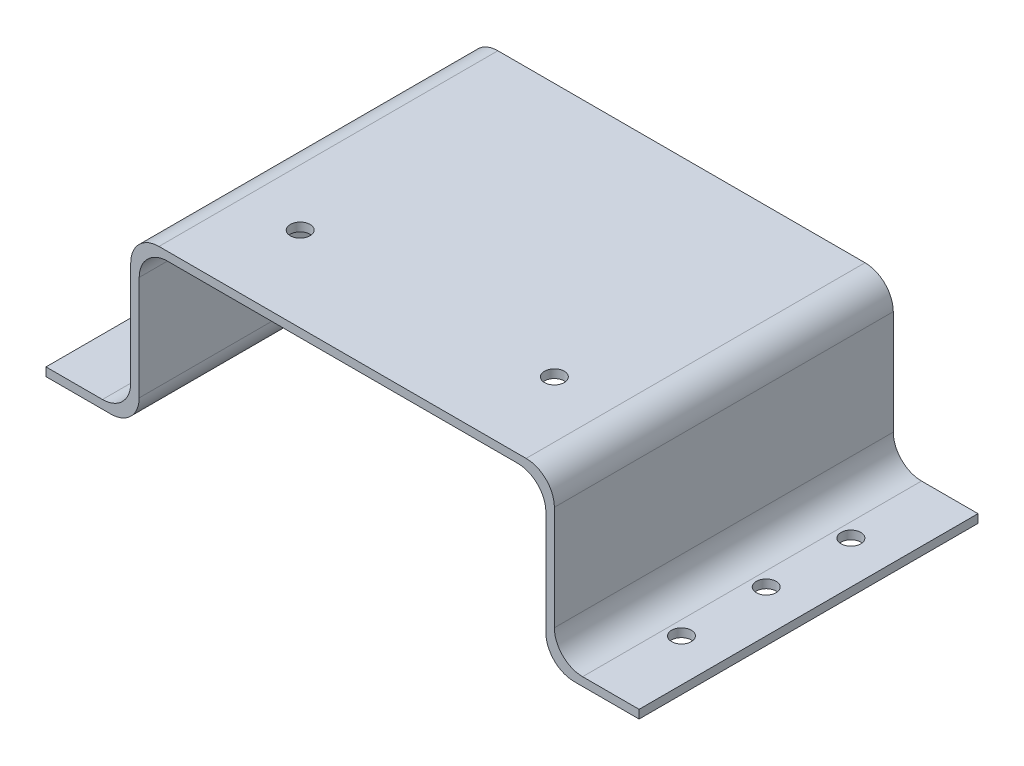
ISO-10303-21;
HEADER;
FILE_DESCRIPTION(('STEP AP214'),'2;1');
FILE_NAME('part.step','',(''),(''),'','','');
FILE_SCHEMA(('AUTOMOTIVE_DESIGN { 1 0 10303 214 1 1 1 1 }'));
ENDSEC;
DATA;
#1=APPLICATION_CONTEXT('core data for automotive mechanical design processes');
#2=APPLICATION_PROTOCOL_DEFINITION('international standard','automotive_design',2000,#1);
#3=PRODUCT_CONTEXT('',#1,'mechanical');
#4=PRODUCT('Part','Part','',(#3));
#5=PRODUCT_RELATED_PRODUCT_CATEGORY('part','',(#4));
#6=PRODUCT_DEFINITION_FORMATION('','',#4);
#7=PRODUCT_DEFINITION_CONTEXT('part definition',#1,'design');
#8=PRODUCT_DEFINITION('design','',#6,#7);
#9=PRODUCT_DEFINITION_SHAPE('','',#8);
#10=(LENGTH_UNIT() NAMED_UNIT(*) SI_UNIT(.MILLI.,.METRE.));
#11=(NAMED_UNIT(*) PLANE_ANGLE_UNIT() SI_UNIT($,.RADIAN.));
#12=(NAMED_UNIT(*) SI_UNIT($,.STERADIAN.) SOLID_ANGLE_UNIT());
#13=UNCERTAINTY_MEASURE_WITH_UNIT(LENGTH_MEASURE(1.E-05),#10,'distance_accuracy_value','');
#14=(GEOMETRIC_REPRESENTATION_CONTEXT(3) GLOBAL_UNCERTAINTY_ASSIGNED_CONTEXT((#13)) GLOBAL_UNIT_ASSIGNED_CONTEXT((#10,
#11,#12)) REPRESENTATION_CONTEXT('',''));
#15=CARTESIAN_POINT('',(0.,0.,0.));
#16=DIRECTION('',(0.,0.,1.));
#17=DIRECTION('',(1.,0.,0.));
#18=AXIS2_PLACEMENT_3D('',#15,#16,#17);
#19=CARTESIAN_POINT('',(-150.,-56.94,-120.));
#20=DIRECTION('',(0.,1.,0.));
#21=DIRECTION('',(-1.,0.,0.));
#22=AXIS2_PLACEMENT_3D('',#19,#20,#21);
#23=PLANE('',#22);
#24=CARTESIAN_POINT('',(-165.,-56.94,-60.));
#25=DIRECTION('',(0.,1.,0.));
#26=DIRECTION('',(0.,0.,1.));
#27=AXIS2_PLACEMENT_3D('',#24,#25,#26);
#28=CIRCLE('',#27,3.5);
#29=CARTESIAN_POINT('',(-165.,-56.94,-56.5));
#30=VERTEX_POINT('',#29);
#31=EDGE_CURVE('E226',#30,#30,#28,.T.);
#32=ORIENTED_EDGE('',*,*,#31,.F.);
#33=EDGE_LOOP('',(#32));
#34=FACE_BOUND('',#33,.T.);
#35=CARTESIAN_POINT('',(-165.,-56.94,-90.));
#36=DIRECTION('',(0.,1.,0.));
#37=DIRECTION('',(0.,0.,1.));
#38=AXIS2_PLACEMENT_3D('',#35,#36,#37);
#39=CIRCLE('',#38,3.5);
#40=CARTESIAN_POINT('',(-165.,-56.94,-86.5));
#41=VERTEX_POINT('',#40);
#42=EDGE_CURVE('E232',#41,#41,#39,.T.);
#43=ORIENTED_EDGE('',*,*,#42,.F.);
#44=EDGE_LOOP('',(#43));
#45=FACE_BOUND('',#44,.T.);
#46=CARTESIAN_POINT('',(-165.,-56.94,-30.));
#47=DIRECTION('',(0.,1.,0.));
#48=DIRECTION('',(0.,0.,1.));
#49=AXIS2_PLACEMENT_3D('',#46,#47,#48);
#50=CIRCLE('',#49,3.5);
#51=CARTESIAN_POINT('',(-165.,-56.94,-26.5));
#52=VERTEX_POINT('',#51);
#53=EDGE_CURVE('E221',#52,#52,#50,.T.);
#54=ORIENTED_EDGE('',*,*,#53,.F.);
#55=EDGE_LOOP('',(#54));
#56=FACE_BOUND('',#55,.T.);
#57=DIRECTION('',(-1.,0.,0.));
#58=VECTOR('',#57,1.);
#59=CARTESIAN_POINT('',(-150.,-56.94,0.));
#60=LINE('',#59,#58);
#61=CARTESIAN_POINT('',(-160.,-56.94,0.));
#62=VERTEX_POINT('',#61);
#63=CARTESIAN_POINT('',(-180.,-56.94,0.));
#64=VERTEX_POINT('',#63);
#65=EDGE_CURVE('E208',#62,#64,#60,.T.);
#66=ORIENTED_EDGE('',*,*,#65,.F.);
#67=DIRECTION('',(0.,0.,1.));
#68=VECTOR('',#67,1.);
#69=CARTESIAN_POINT('',(-160.,-56.94,-120.));
#70=LINE('',#69,#68);
#71=CARTESIAN_POINT('',(-160.,-56.94,-120.));
#72=VERTEX_POINT('',#71);
#73=EDGE_CURVE('E178',#62,#72,#70,.F.);
#74=ORIENTED_EDGE('',*,*,#73,.T.);
#75=DIRECTION('',(-1.,0.,0.));
#76=VECTOR('',#75,1.);
#77=CARTESIAN_POINT('',(-150.,-56.94,-120.));
#78=LINE('',#77,#76);
#79=CARTESIAN_POINT('',(-180.,-56.94,-120.));
#80=VERTEX_POINT('',#79);
#81=EDGE_CURVE('E171',#72,#80,#78,.T.);
#82=ORIENTED_EDGE('',*,*,#81,.T.);
#83=DIRECTION('',(0.,0.,1.));
#84=VECTOR('',#83,1.);
#85=CARTESIAN_POINT('',(-180.,-56.94,-120.));
#86=LINE('',#85,#84);
#87=EDGE_CURVE('E175',#80,#64,#86,.T.);
#88=ORIENTED_EDGE('',*,*,#87,.T.);
#89=EDGE_LOOP('',(#66,#74,#82,#88));
#90=FACE_BOUND('',#89,.T.);
#91=ADVANCED_FACE('F33',(#34,#45,#56,#90),#23,.T.);
#92=CARTESIAN_POINT('',(-150.,0.,-120.));
#93=DIRECTION('',(-1.,0.,0.));
#94=DIRECTION('',(0.,0.,1.));
#95=AXIS2_PLACEMENT_3D('',#92,#93,#94);
#96=PLANE('',#95);
#97=DIRECTION('',(0.,-1.,0.));
#98=VECTOR('',#97,1.);
#99=CARTESIAN_POINT('',(-150.,0.,-120.));
#100=LINE('',#99,#98);
#101=CARTESIAN_POINT('',(-150.,-10.,-120.));
#102=VERTEX_POINT('',#101);
#103=CARTESIAN_POINT('',(-150.,-46.94,-120.));
#104=VERTEX_POINT('',#103);
#105=EDGE_CURVE('E196',#102,#104,#100,.T.);
#106=ORIENTED_EDGE('',*,*,#105,.T.);
#107=DIRECTION('',(0.,0.,1.));
#108=VECTOR('',#107,1.);
#109=CARTESIAN_POINT('',(-150.,-46.94,0.));
#110=LINE('',#109,#108);
#111=CARTESIAN_POINT('',(-150.,-46.94,0.));
#112=VERTEX_POINT('',#111);
#113=EDGE_CURVE('E276',#104,#112,#110,.T.);
#114=ORIENTED_EDGE('',*,*,#113,.T.);
#115=DIRECTION('',(0.,-1.,0.));
#116=VECTOR('',#115,1.);
#117=CARTESIAN_POINT('',(-150.,0.,0.));
#118=LINE('',#117,#116);
#119=CARTESIAN_POINT('',(-150.,-10.,0.));
#120=VERTEX_POINT('',#119);
#121=EDGE_CURVE('E181',#120,#112,#118,.T.);
#122=ORIENTED_EDGE('',*,*,#121,.F.);
#123=DIRECTION('',(0.,0.,1.));
#124=VECTOR('',#123,1.);
#125=CARTESIAN_POINT('',(-150.,-10.,-120.));
#126=LINE('',#125,#124);
#127=EDGE_CURVE('E274',#120,#102,#126,.F.);
#128=ORIENTED_EDGE('',*,*,#127,.T.);
#129=EDGE_LOOP('',(#106,#114,#122,#128));
#130=FACE_BOUND('',#129,.T.);
#131=ADVANCED_FACE('F412',(#130),#96,.T.);
#132=CARTESIAN_POINT('',(0.,0.,-120.));
#133=DIRECTION('',(0.,1.,0.));
#134=DIRECTION('',(0.,0.,1.));
#135=AXIS2_PLACEMENT_3D('',#132,#133,#134);
#136=PLANE('',#135);
#137=CARTESIAN_POINT('',(-120.,0.,-30.));
#138=DIRECTION('',(0.,1.,0.));
#139=DIRECTION('',(0.,0.,1.));
#140=AXIS2_PLACEMENT_3D('',#137,#138,#139);
#141=CIRCLE('',#140,3.50000000000001);
#142=CARTESIAN_POINT('',(-120.,0.,-26.5));
#143=VERTEX_POINT('',#142);
#144=EDGE_CURVE('E237',#143,#143,#141,.T.);
#145=ORIENTED_EDGE('',*,*,#144,.F.);
#146=EDGE_LOOP('',(#145));
#147=FACE_BOUND('',#146,.T.);
#148=CARTESIAN_POINT('',(-30.,0.,-30.));
#149=DIRECTION('',(0.,1.,0.));
#150=DIRECTION('',(0.,0.,1.));
#151=AXIS2_PLACEMENT_3D('',#148,#149,#150);
#152=CIRCLE('',#151,3.5);
#153=CARTESIAN_POINT('',(-30.,0.,-26.5));
#154=VERTEX_POINT('',#153);
#155=EDGE_CURVE('E233',#154,#154,#152,.T.);
#156=ORIENTED_EDGE('',*,*,#155,.F.);
#157=EDGE_LOOP('',(#156));
#158=FACE_BOUND('',#157,.T.);
#159=DIRECTION('',(-1.,0.,0.));
#160=VECTOR('',#159,1.);
#161=CARTESIAN_POINT('',(0.,0.,0.));
#162=LINE('',#161,#160);
#163=CARTESIAN_POINT('',(-10.,0.,0.));
#164=VERTEX_POINT('',#163);
#165=CARTESIAN_POINT('',(-140.,0.,0.));
#166=VERTEX_POINT('',#165);
#167=EDGE_CURVE('E321',#164,#166,#162,.T.);
#168=ORIENTED_EDGE('',*,*,#167,.F.);
#169=DIRECTION('',(0.,0.,1.));
#170=VECTOR('',#169,1.);
#171=CARTESIAN_POINT('',(-10.,0.,-120.));
#172=LINE('',#171,#170);
#173=CARTESIAN_POINT('',(-10.,0.,-120.));
#174=VERTEX_POINT('',#173);
#175=EDGE_CURVE('E291',#164,#174,#172,.F.);
#176=ORIENTED_EDGE('',*,*,#175,.T.);
#177=DIRECTION('',(-1.,0.,0.));
#178=VECTOR('',#177,1.);
#179=CARTESIAN_POINT('',(0.,0.,-120.));
#180=LINE('',#179,#178);
#181=CARTESIAN_POINT('',(-140.,0.,-120.));
#182=VERTEX_POINT('',#181);
#183=EDGE_CURVE('E201',#174,#182,#180,.T.);
#184=ORIENTED_EDGE('',*,*,#183,.T.);
#185=DIRECTION('',(0.,0.,1.));
#186=VECTOR('',#185,1.);
#187=CARTESIAN_POINT('',(-140.,0.,-120.));
#188=LINE('',#187,#186);
#189=EDGE_CURVE('E288',#182,#166,#188,.T.);
#190=ORIENTED_EDGE('',*,*,#189,.T.);
#191=EDGE_LOOP('',(#168,#176,#184,#190));
#192=FACE_BOUND('',#191,.T.);
#193=ADVANCED_FACE('F409',(#147,#158,#192),#136,.T.);
#194=CARTESIAN_POINT('',(0.,0.,-120.));
#195=DIRECTION('',(1.,0.,0.));
#196=DIRECTION('',(0.,1.,0.));
#197=AXIS2_PLACEMENT_3D('',#194,#195,#196);
#198=PLANE('',#197);
#199=DIRECTION('',(0.,1.,0.));
#200=VECTOR('',#199,1.);
#201=CARTESIAN_POINT('',(0.,0.,0.));
#202=LINE('',#201,#200);
#203=CARTESIAN_POINT('',(0.,-46.94,0.));
#204=VERTEX_POINT('',#203);
#205=CARTESIAN_POINT('',(0.,-10.,0.));
#206=VERTEX_POINT('',#205);
#207=EDGE_CURVE('E309',#204,#206,#202,.T.);
#208=ORIENTED_EDGE('',*,*,#207,.F.);
#209=DIRECTION('',(0.,0.,1.));
#210=VECTOR('',#209,1.);
#211=CARTESIAN_POINT('',(0.,-46.94,-120.));
#212=LINE('',#211,#210);
#213=CARTESIAN_POINT('',(0.,-46.94,-120.));
#214=VERTEX_POINT('',#213);
#215=EDGE_CURVE('E286',#204,#214,#212,.F.);
#216=ORIENTED_EDGE('',*,*,#215,.T.);
#217=DIRECTION('',(0.,1.,0.));
#218=VECTOR('',#217,1.);
#219=CARTESIAN_POINT('',(0.,0.,-120.));
#220=LINE('',#219,#218);
#221=CARTESIAN_POINT('',(0.,-10.,-120.));
#222=VERTEX_POINT('',#221);
#223=EDGE_CURVE('E328',#214,#222,#220,.T.);
#224=ORIENTED_EDGE('',*,*,#223,.T.);
#225=DIRECTION('',(0.,0.,1.));
#226=VECTOR('',#225,1.);
#227=CARTESIAN_POINT('',(0.,-10.,-120.));
#228=LINE('',#227,#226);
#229=EDGE_CURVE('E283',#222,#206,#228,.T.);
#230=ORIENTED_EDGE('',*,*,#229,.T.);
#231=EDGE_LOOP('',(#208,#216,#224,#230));
#232=FACE_BOUND('',#231,.T.);
#233=ADVANCED_FACE('F317',(#232),#198,.T.);
#234=CARTESIAN_POINT('',(0.,-56.94,-120.));
#235=DIRECTION('',(0.,1.,0.));
#236=DIRECTION('',(0.,0.,1.));
#237=AXIS2_PLACEMENT_3D('',#234,#235,#236);
#238=PLANE('',#237);
#239=CARTESIAN_POINT('',(15.,-56.94,-60.));
#240=DIRECTION('',(0.,1.,0.));
#241=DIRECTION('',(0.,0.,1.));
#242=AXIS2_PLACEMENT_3D('',#239,#240,#241);
#243=CIRCLE('',#242,3.5);
#244=CARTESIAN_POINT('',(15.,-56.94,-56.5));
#245=VERTEX_POINT('',#244);
#246=EDGE_CURVE('E214',#245,#245,#243,.T.);
#247=ORIENTED_EDGE('',*,*,#246,.F.);
#248=EDGE_LOOP('',(#247));
#249=FACE_BOUND('',#248,.T.);
#250=CARTESIAN_POINT('',(15.,-56.94,-90.));
#251=DIRECTION('',(0.,1.,0.));
#252=DIRECTION('',(0.,0.,1.));
#253=AXIS2_PLACEMENT_3D('',#250,#251,#252);
#254=CIRCLE('',#253,3.5);
#255=CARTESIAN_POINT('',(15.,-56.94,-86.5));
#256=VERTEX_POINT('',#255);
#257=EDGE_CURVE('E220',#256,#256,#254,.T.);
#258=ORIENTED_EDGE('',*,*,#257,.F.);
#259=EDGE_LOOP('',(#258));
#260=FACE_BOUND('',#259,.T.);
#261=CARTESIAN_POINT('',(15.,-56.94,-30.));
#262=DIRECTION('',(0.,1.,0.));
#263=DIRECTION('',(0.,0.,1.));
#264=AXIS2_PLACEMENT_3D('',#261,#262,#263);
#265=CIRCLE('',#264,3.5);
#266=CARTESIAN_POINT('',(15.,-56.94,-26.5));
#267=VERTEX_POINT('',#266);
#268=EDGE_CURVE('E209',#267,#267,#265,.T.);
#269=ORIENTED_EDGE('',*,*,#268,.F.);
#270=EDGE_LOOP('',(#269));
#271=FACE_BOUND('',#270,.T.);
#272=DIRECTION('',(-1.,0.,0.));
#273=VECTOR('',#272,1.);
#274=CARTESIAN_POINT('',(0.,-56.94,-120.));
#275=LINE('',#274,#273);
#276=CARTESIAN_POINT('',(30.,-56.94,-120.));
#277=VERTEX_POINT('',#276);
#278=CARTESIAN_POINT('',(10.,-56.94,-120.));
#279=VERTEX_POINT('',#278);
#280=EDGE_CURVE('E327',#277,#279,#275,.T.);
#281=ORIENTED_EDGE('',*,*,#280,.T.);
#282=DIRECTION('',(0.,0.,1.));
#283=VECTOR('',#282,1.);
#284=CARTESIAN_POINT('',(10.,-56.94,0.));
#285=LINE('',#284,#283);
#286=CARTESIAN_POINT('',(10.,-56.94,0.));
#287=VERTEX_POINT('',#286);
#288=EDGE_CURVE('E280',#279,#287,#285,.T.);
#289=ORIENTED_EDGE('',*,*,#288,.T.);
#290=DIRECTION('',(-1.,0.,0.));
#291=VECTOR('',#290,1.);
#292=CARTESIAN_POINT('',(0.,-56.94,0.));
#293=LINE('',#292,#291);
#294=CARTESIAN_POINT('',(30.,-56.94,0.));
#295=VERTEX_POINT('',#294);
#296=EDGE_CURVE('E312',#295,#287,#293,.T.);
#297=ORIENTED_EDGE('',*,*,#296,.F.);
#298=DIRECTION('',(0.,0.,1.));
#299=VECTOR('',#298,1.);
#300=CARTESIAN_POINT('',(30.,-56.94,-120.));
#301=LINE('',#300,#299);
#302=EDGE_CURVE('E242',#277,#295,#301,.T.);
#303=ORIENTED_EDGE('',*,*,#302,.F.);
#304=EDGE_LOOP('',(#281,#289,#297,#303));
#305=FACE_BOUND('',#304,.T.);
#306=ADVANCED_FACE('F330',(#249,#260,#271,#305),#238,.T.);
#307=CARTESIAN_POINT('',(30.,-56.94,-120.));
#308=DIRECTION('',(-1.,0.,0.));
#309=DIRECTION('',(0.,0.,1.));
#310=AXIS2_PLACEMENT_3D('',#307,#308,#309);
#311=PLANE('',#310);
#312=DIRECTION('',(0.,-1.,0.));
#313=VECTOR('',#312,1.);
#314=CARTESIAN_POINT('',(30.,-56.94,0.));
#315=LINE('',#314,#313);
#316=CARTESIAN_POINT('',(30.,-59.94,0.));
#317=VERTEX_POINT('',#316);
#318=EDGE_CURVE('E356',#295,#317,#315,.T.);
#319=ORIENTED_EDGE('',*,*,#318,.T.);
#320=DIRECTION('',(0.,0.,1.));
#321=VECTOR('',#320,1.);
#322=CARTESIAN_POINT('',(30.,-59.94,-120.));
#323=LINE('',#322,#321);
#324=CARTESIAN_POINT('',(30.,-59.94,-120.));
#325=VERTEX_POINT('',#324);
#326=EDGE_CURVE('E198',#325,#317,#323,.T.);
#327=ORIENTED_EDGE('',*,*,#326,.F.);
#328=DIRECTION('',(0.,-1.,0.));
#329=VECTOR('',#328,1.);
#330=CARTESIAN_POINT('',(30.,-56.94,-120.));
#331=LINE('',#330,#329);
#332=EDGE_CURVE('E332',#277,#325,#331,.T.);
#333=ORIENTED_EDGE('',*,*,#332,.F.);
#334=ORIENTED_EDGE('',*,*,#302,.T.);
#335=EDGE_LOOP('',(#319,#327,#333,#334));
#336=FACE_BOUND('',#335,.T.);
#337=ADVANCED_FACE('F516',(#336),#311,.F.);
#338=CARTESIAN_POINT('',(0.,-59.94,-120.));
#339=DIRECTION('',(0.,1.,0.));
#340=DIRECTION('',(0.,0.,1.));
#341=AXIS2_PLACEMENT_3D('',#338,#339,#340);
#342=PLANE('',#341);
#343=CARTESIAN_POINT('',(15.,-59.94,-60.));
#344=DIRECTION('',(0.,1.,0.));
#345=DIRECTION('',(0.,0.,1.));
#346=AXIS2_PLACEMENT_3D('',#343,#344,#345);
#347=CIRCLE('',#346,3.5);
#348=CARTESIAN_POINT('',(15.,-59.94,-56.5));
#349=VERTEX_POINT('',#348);
#350=EDGE_CURVE('E213',#349,#349,#347,.T.);
#351=ORIENTED_EDGE('',*,*,#350,.T.);
#352=EDGE_LOOP('',(#351));
#353=FACE_BOUND('',#352,.T.);
#354=CARTESIAN_POINT('',(15.,-59.94,-90.));
#355=DIRECTION('',(0.,1.,0.));
#356=DIRECTION('',(0.,0.,1.));
#357=AXIS2_PLACEMENT_3D('',#354,#355,#356);
#358=CIRCLE('',#357,3.5);
#359=CARTESIAN_POINT('',(15.,-59.94,-86.5));
#360=VERTEX_POINT('',#359);
#361=EDGE_CURVE('E210',#360,#360,#358,.T.);
#362=ORIENTED_EDGE('',*,*,#361,.T.);
#363=EDGE_LOOP('',(#362));
#364=FACE_BOUND('',#363,.T.);
#365=CARTESIAN_POINT('',(15.,-59.94,-30.));
#366=DIRECTION('',(0.,1.,0.));
#367=DIRECTION('',(0.,0.,1.));
#368=AXIS2_PLACEMENT_3D('',#365,#366,#367);
#369=CIRCLE('',#368,3.5);
#370=CARTESIAN_POINT('',(15.,-59.94,-26.5));
#371=VERTEX_POINT('',#370);
#372=EDGE_CURVE('E205',#371,#371,#369,.T.);
#373=ORIENTED_EDGE('',*,*,#372,.T.);
#374=EDGE_LOOP('',(#373));
#375=FACE_BOUND('',#374,.T.);
#376=DIRECTION('',(1.,0.,0.));
#377=VECTOR('',#376,1.);
#378=CARTESIAN_POINT('',(0.,-59.94,0.));
#379=LINE('',#378,#377);
#380=CARTESIAN_POINT('',(7.00000000000001,-59.94,0.));
#381=VERTEX_POINT('',#380);
#382=EDGE_CURVE('E353',#317,#381,#379,.F.);
#383=ORIENTED_EDGE('',*,*,#382,.T.);
#384=DIRECTION('',(0.,0.,1.));
#385=VECTOR('',#384,1.);
#386=CARTESIAN_POINT('',(7.00000000000001,-59.94,-120.));
#387=LINE('',#386,#385);
#388=CARTESIAN_POINT('',(7.00000000000001,-59.94,-120.));
#389=VERTEX_POINT('',#388);
#390=EDGE_CURVE('E268',#381,#389,#387,.F.);
#391=ORIENTED_EDGE('',*,*,#390,.T.);
#392=DIRECTION('',(1.,0.,0.));
#393=VECTOR('',#392,1.);
#394=CARTESIAN_POINT('',(0.,-59.94,-120.));
#395=LINE('',#394,#393);
#396=EDGE_CURVE('E335',#325,#389,#395,.F.);
#397=ORIENTED_EDGE('',*,*,#396,.F.);
#398=ORIENTED_EDGE('',*,*,#326,.T.);
#399=EDGE_LOOP('',(#383,#391,#397,#398));
#400=FACE_BOUND('',#399,.T.);
#401=ADVANCED_FACE('F368',(#353,#364,#375,#400),#342,.F.);
#402=CARTESIAN_POINT('',(-3.,0.,-120.));
#403=DIRECTION('',(1.,0.,0.));
#404=DIRECTION('',(0.,1.,0.));
#405=AXIS2_PLACEMENT_3D('',#402,#403,#404);
#406=PLANE('',#405);
#407=DIRECTION('',(0.,1.,0.));
#408=VECTOR('',#407,1.);
#409=CARTESIAN_POINT('',(-3.,0.,-120.));
#410=LINE('',#409,#408);
#411=CARTESIAN_POINT('',(-2.99999999999999,-49.94,-120.));
#412=VERTEX_POINT('',#411);
#413=CARTESIAN_POINT('',(-3.,-13.,-120.));
#414=VERTEX_POINT('',#413);
#415=EDGE_CURVE('E381',#412,#414,#410,.T.);
#416=ORIENTED_EDGE('',*,*,#415,.F.);
#417=DIRECTION('',(0.,0.,1.));
#418=VECTOR('',#417,1.);
#419=CARTESIAN_POINT('',(-2.99999999999999,-49.94,-120.));
#420=LINE('',#419,#418);
#421=CARTESIAN_POINT('',(-2.99999999999999,-49.94,0.));
#422=VERTEX_POINT('',#421);
#423=EDGE_CURVE('E265',#412,#422,#420,.T.);
#424=ORIENTED_EDGE('',*,*,#423,.T.);
#425=DIRECTION('',(0.,1.,0.));
#426=VECTOR('',#425,1.);
#427=CARTESIAN_POINT('',(-3.,0.,0.));
#428=LINE('',#427,#426);
#429=CARTESIAN_POINT('',(-3.,-13.,0.));
#430=VERTEX_POINT('',#429);
#431=EDGE_CURVE('E350',#422,#430,#428,.T.);
#432=ORIENTED_EDGE('',*,*,#431,.T.);
#433=DIRECTION('',(0.,0.,1.));
#434=VECTOR('',#433,1.);
#435=CARTESIAN_POINT('',(-3.,-13.,-120.));
#436=LINE('',#435,#434);
#437=EDGE_CURVE('E263',#430,#414,#436,.F.);
#438=ORIENTED_EDGE('',*,*,#437,.T.);
#439=EDGE_LOOP('',(#416,#424,#432,#438));
#440=FACE_BOUND('',#439,.T.);
#441=ADVANCED_FACE('F379',(#440),#406,.F.);
#442=CARTESIAN_POINT('',(0.,-3.,-120.));
#443=DIRECTION('',(0.,1.,0.));
#444=DIRECTION('',(0.,0.,1.));
#445=AXIS2_PLACEMENT_3D('',#442,#443,#444);
#446=PLANE('',#445);
#447=CARTESIAN_POINT('',(-120.,-3.,-30.));
#448=DIRECTION('',(0.,1.,0.));
#449=DIRECTION('',(0.,0.,1.));
#450=AXIS2_PLACEMENT_3D('',#447,#448,#449);
#451=CIRCLE('',#450,3.50000000000001);
#452=CARTESIAN_POINT('',(-120.,-3.,-26.5));
#453=VERTEX_POINT('',#452);
#454=EDGE_CURVE('E234',#453,#453,#451,.T.);
#455=ORIENTED_EDGE('',*,*,#454,.T.);
#456=EDGE_LOOP('',(#455));
#457=FACE_BOUND('',#456,.T.);
#458=CARTESIAN_POINT('',(-30.,-3.,-30.));
#459=DIRECTION('',(0.,1.,0.));
#460=DIRECTION('',(0.,0.,1.));
#461=AXIS2_PLACEMENT_3D('',#458,#459,#460);
#462=CIRCLE('',#461,3.5);
#463=CARTESIAN_POINT('',(-30.,-3.,-26.5));
#464=VERTEX_POINT('',#463);
#465=EDGE_CURVE('E229',#464,#464,#462,.T.);
#466=ORIENTED_EDGE('',*,*,#465,.T.);
#467=EDGE_LOOP('',(#466));
#468=FACE_BOUND('',#467,.T.);
#469=DIRECTION('',(1.,0.,0.));
#470=VECTOR('',#469,1.);
#471=CARTESIAN_POINT('',(0.,-3.,-120.));
#472=LINE('',#471,#470);
#473=CARTESIAN_POINT('',(-13.,-3.,-120.));
#474=VERTEX_POINT('',#473);
#475=CARTESIAN_POINT('',(-137.,-3.,-120.));
#476=VERTEX_POINT('',#475);
#477=EDGE_CURVE('E382',#474,#476,#472,.F.);
#478=ORIENTED_EDGE('',*,*,#477,.F.);
#479=DIRECTION('',(0.,0.,1.));
#480=VECTOR('',#479,1.);
#481=CARTESIAN_POINT('',(-13.,-3.,0.));
#482=LINE('',#481,#480);
#483=CARTESIAN_POINT('',(-13.,-3.,0.));
#484=VERTEX_POINT('',#483);
#485=EDGE_CURVE('E271',#474,#484,#482,.T.);
#486=ORIENTED_EDGE('',*,*,#485,.T.);
#487=DIRECTION('',(1.,0.,0.));
#488=VECTOR('',#487,1.);
#489=CARTESIAN_POINT('',(0.,-3.,0.));
#490=LINE('',#489,#488);
#491=CARTESIAN_POINT('',(-137.,-3.,0.));
#492=VERTEX_POINT('',#491);
#493=EDGE_CURVE('E348',#484,#492,#490,.F.);
#494=ORIENTED_EDGE('',*,*,#493,.T.);
#495=DIRECTION('',(0.,0.,1.));
#496=VECTOR('',#495,1.);
#497=CARTESIAN_POINT('',(-137.,-3.,-120.));
#498=LINE('',#497,#496);
#499=EDGE_CURVE('E48',#492,#476,#498,.F.);
#500=ORIENTED_EDGE('',*,*,#499,.T.);
#501=EDGE_LOOP('',(#478,#486,#494,#500));
#502=FACE_BOUND('',#501,.T.);
#503=ADVANCED_FACE('F448',(#457,#468,#502),#446,.F.);
#504=CARTESIAN_POINT('',(-147.,0.,-120.));
#505=DIRECTION('',(-1.,0.,0.));
#506=DIRECTION('',(0.,0.,1.));
#507=AXIS2_PLACEMENT_3D('',#504,#505,#506);
#508=PLANE('',#507);
#509=DIRECTION('',(0.,1.,0.));
#510=VECTOR('',#509,1.);
#511=CARTESIAN_POINT('',(-147.,0.,0.));
#512=LINE('',#511,#510);
#513=CARTESIAN_POINT('',(-147.,-13.,0.));
#514=VERTEX_POINT('',#513);
#515=CARTESIAN_POINT('',(-147.,-49.94,0.));
#516=VERTEX_POINT('',#515);
#517=EDGE_CURVE('E345',#514,#516,#512,.F.);
#518=ORIENTED_EDGE('',*,*,#517,.T.);
#519=DIRECTION('',(0.,0.,1.));
#520=VECTOR('',#519,1.);
#521=CARTESIAN_POINT('',(-147.,-49.94,-120.));
#522=LINE('',#521,#520);
#523=CARTESIAN_POINT('',(-147.,-49.94,-120.));
#524=VERTEX_POINT('',#523);
#525=EDGE_CURVE('E253',#516,#524,#522,.F.);
#526=ORIENTED_EDGE('',*,*,#525,.T.);
#527=DIRECTION('',(0.,1.,0.));
#528=VECTOR('',#527,1.);
#529=CARTESIAN_POINT('',(-147.,0.,-120.));
#530=LINE('',#529,#528);
#531=CARTESIAN_POINT('',(-147.,-13.,-120.));
#532=VERTEX_POINT('',#531);
#533=EDGE_CURVE('E384',#532,#524,#530,.F.);
#534=ORIENTED_EDGE('',*,*,#533,.F.);
#535=DIRECTION('',(0.,0.,1.));
#536=VECTOR('',#535,1.);
#537=CARTESIAN_POINT('',(-147.,-13.,0.));
#538=LINE('',#537,#536);
#539=EDGE_CURVE('E250',#532,#514,#538,.T.);
#540=ORIENTED_EDGE('',*,*,#539,.T.);
#541=EDGE_LOOP('',(#518,#526,#534,#540));
#542=FACE_BOUND('',#541,.T.);
#543=ADVANCED_FACE('F442',(#542),#508,.F.);
#544=CARTESIAN_POINT('',(-150.,-59.94,-120.));
#545=DIRECTION('',(0.,1.,0.));
#546=DIRECTION('',(-1.,0.,0.));
#547=AXIS2_PLACEMENT_3D('',#544,#545,#546);
#548=PLANE('',#547);
#549=CARTESIAN_POINT('',(-165.,-59.94,-60.));
#550=DIRECTION('',(0.,1.,0.));
#551=DIRECTION('',(-1.,0.,0.));
#552=AXIS2_PLACEMENT_3D('',#549,#550,#551);
#553=CIRCLE('',#552,3.5);
#554=CARTESIAN_POINT('',(-168.5,-59.94,-60.));
#555=VERTEX_POINT('',#554);
#556=EDGE_CURVE('E225',#555,#555,#553,.T.);
#557=ORIENTED_EDGE('',*,*,#556,.T.);
#558=EDGE_LOOP('',(#557));
#559=FACE_BOUND('',#558,.T.);
#560=CARTESIAN_POINT('',(-165.,-59.94,-90.));
#561=DIRECTION('',(0.,1.,0.));
#562=DIRECTION('',(-1.,0.,0.));
#563=AXIS2_PLACEMENT_3D('',#560,#561,#562);
#564=CIRCLE('',#563,3.5);
#565=CARTESIAN_POINT('',(-168.5,-59.94,-90.));
#566=VERTEX_POINT('',#565);
#567=EDGE_CURVE('E222',#566,#566,#564,.T.);
#568=ORIENTED_EDGE('',*,*,#567,.T.);
#569=EDGE_LOOP('',(#568));
#570=FACE_BOUND('',#569,.T.);
#571=CARTESIAN_POINT('',(-165.,-59.94,-30.));
#572=DIRECTION('',(0.,1.,0.));
#573=DIRECTION('',(-1.,0.,0.));
#574=AXIS2_PLACEMENT_3D('',#571,#572,#573);
#575=CIRCLE('',#574,3.5);
#576=CARTESIAN_POINT('',(-168.5,-59.94,-30.));
#577=VERTEX_POINT('',#576);
#578=EDGE_CURVE('E217',#577,#577,#575,.T.);
#579=ORIENTED_EDGE('',*,*,#578,.T.);
#580=EDGE_LOOP('',(#579));
#581=FACE_BOUND('',#580,.T.);
#582=DIRECTION('',(-1.,0.,0.));
#583=VECTOR('',#582,1.);
#584=CARTESIAN_POINT('',(-150.,-59.94,-120.));
#585=LINE('',#584,#583);
#586=CARTESIAN_POINT('',(-157.,-59.94,-120.));
#587=VERTEX_POINT('',#586);
#588=CARTESIAN_POINT('',(-180.,-59.94,-120.));
#589=VERTEX_POINT('',#588);
#590=EDGE_CURVE('E187',#587,#589,#585,.T.);
#591=ORIENTED_EDGE('',*,*,#590,.F.);
#592=DIRECTION('',(0.,0.,1.));
#593=VECTOR('',#592,1.);
#594=CARTESIAN_POINT('',(-157.,-59.94,-120.));
#595=LINE('',#594,#593);
#596=CARTESIAN_POINT('',(-157.,-59.94,0.));
#597=VERTEX_POINT('',#596);
#598=EDGE_CURVE('E238',#587,#597,#595,.T.);
#599=ORIENTED_EDGE('',*,*,#598,.T.);
#600=DIRECTION('',(-1.,0.,0.));
#601=VECTOR('',#600,1.);
#602=CARTESIAN_POINT('',(-150.,-59.94,0.));
#603=LINE('',#602,#601);
#604=CARTESIAN_POINT('',(-180.,-59.94,0.));
#605=VERTEX_POINT('',#604);
#606=EDGE_CURVE('E343',#597,#605,#603,.T.);
#607=ORIENTED_EDGE('',*,*,#606,.T.);
#608=DIRECTION('',(0.,0.,1.));
#609=VECTOR('',#608,1.);
#610=CARTESIAN_POINT('',(-180.,-59.94,-120.));
#611=LINE('',#610,#609);
#612=EDGE_CURVE('E195',#589,#605,#611,.T.);
#613=ORIENTED_EDGE('',*,*,#612,.F.);
#614=EDGE_LOOP('',(#591,#599,#607,#613));
#615=FACE_BOUND('',#614,.T.);
#616=ADVANCED_FACE('F434',(#559,#570,#581,#615),#548,.F.);
#617=CARTESIAN_POINT('',(-180.,-59.94,-120.));
#618=DIRECTION('',(1.,0.,0.));
#619=DIRECTION('',(0.,0.,-1.));
#620=AXIS2_PLACEMENT_3D('',#617,#618,#619);
#621=PLANE('',#620);
#622=DIRECTION('',(0.,1.,0.));
#623=VECTOR('',#622,1.);
#624=CARTESIAN_POINT('',(-180.,-59.94,0.));
#625=LINE('',#624,#623);
#626=EDGE_CURVE('E194',#605,#64,#625,.T.);
#627=ORIENTED_EDGE('',*,*,#626,.T.);
#628=ORIENTED_EDGE('',*,*,#87,.F.);
#629=DIRECTION('',(0.,1.,0.));
#630=VECTOR('',#629,1.);
#631=CARTESIAN_POINT('',(-180.,-59.94,-120.));
#632=LINE('',#631,#630);
#633=EDGE_CURVE('E180',#589,#80,#632,.T.);
#634=ORIENTED_EDGE('',*,*,#633,.F.);
#635=ORIENTED_EDGE('',*,*,#612,.T.);
#636=EDGE_LOOP('',(#627,#628,#634,#635));
#637=FACE_BOUND('',#636,.T.);
#638=ADVANCED_FACE('F192',(#637),#621,.F.);
#639=CARTESIAN_POINT('',(0.,0.,-120.));
#640=DIRECTION('',(0.,0.,-1.));
#641=DIRECTION('',(-1.,0.,0.));
#642=AXIS2_PLACEMENT_3D('',#639,#640,#641);
#643=PLANE('',#642);
#644=ORIENTED_EDGE('',*,*,#533,.T.);
#645=CARTESIAN_POINT('',(-157.,-49.94,-120.));
#646=DIRECTION('',(0.,0.,-1.));
#647=DIRECTION('',(-1.,0.,0.));
#648=AXIS2_PLACEMENT_3D('',#645,#646,#647);
#649=CIRCLE('',#648,10.);
#650=EDGE_CURVE('E261',#524,#587,#649,.T.);
#651=ORIENTED_EDGE('',*,*,#650,.T.);
#652=ORIENTED_EDGE('',*,*,#590,.T.);
#653=ORIENTED_EDGE('',*,*,#633,.T.);
#654=ORIENTED_EDGE('',*,*,#81,.F.);
#655=CARTESIAN_POINT('',(-160.,-46.94,-120.));
#656=DIRECTION('',(0.,0.,-1.));
#657=DIRECTION('',(-1.,0.,0.));
#658=AXIS2_PLACEMENT_3D('',#655,#656,#657);
#659=CIRCLE('',#658,10.);
#660=EDGE_CURVE('E302',#72,#104,#659,.F.);
#661=ORIENTED_EDGE('',*,*,#660,.T.);
#662=ORIENTED_EDGE('',*,*,#105,.F.);
#663=CARTESIAN_POINT('',(-140.,-10.,-120.));
#664=DIRECTION('',(0.,0.,-1.));
#665=DIRECTION('',(-1.,0.,0.));
#666=AXIS2_PLACEMENT_3D('',#663,#664,#665);
#667=CIRCLE('',#666,10.);
#668=EDGE_CURVE('E255',#102,#182,#667,.T.);
#669=ORIENTED_EDGE('',*,*,#668,.T.);
#670=ORIENTED_EDGE('',*,*,#183,.F.);
#671=CARTESIAN_POINT('',(-10.,-10.,-120.));
#672=DIRECTION('',(0.,0.,-1.));
#673=DIRECTION('',(-1.,0.,0.));
#674=AXIS2_PLACEMENT_3D('',#671,#672,#673);
#675=CIRCLE('',#674,10.);
#676=EDGE_CURVE('E257',#174,#222,#675,.T.);
#677=ORIENTED_EDGE('',*,*,#676,.T.);
#678=ORIENTED_EDGE('',*,*,#223,.F.);
#679=CARTESIAN_POINT('',(10.,-46.94,-120.));
#680=DIRECTION('',(0.,0.,-1.));
#681=DIRECTION('',(-1.,0.,0.));
#682=AXIS2_PLACEMENT_3D('',#679,#680,#681);
#683=CIRCLE('',#682,10.);
#684=EDGE_CURVE('E11',#214,#279,#683,.F.);
#685=ORIENTED_EDGE('',*,*,#684,.T.);
#686=ORIENTED_EDGE('',*,*,#280,.F.);
#687=ORIENTED_EDGE('',*,*,#332,.T.);
#688=ORIENTED_EDGE('',*,*,#396,.T.);
#689=CARTESIAN_POINT('',(7.00000000000001,-49.94,-120.));
#690=DIRECTION('',(0.,0.,-1.));
#691=DIRECTION('',(-1.,0.,0.));
#692=AXIS2_PLACEMENT_3D('',#689,#690,#691);
#693=CIRCLE('',#692,10.);
#694=EDGE_CURVE('E259',#389,#412,#693,.T.);
#695=ORIENTED_EDGE('',*,*,#694,.T.);
#696=ORIENTED_EDGE('',*,*,#415,.T.);
#697=CARTESIAN_POINT('',(-13.,-13.,-120.));
#698=DIRECTION('',(0.,0.,-1.));
#699=DIRECTION('',(-1.,0.,0.));
#700=AXIS2_PLACEMENT_3D('',#697,#698,#699);
#701=CIRCLE('',#700,10.);
#702=EDGE_CURVE('E55',#414,#474,#701,.F.);
#703=ORIENTED_EDGE('',*,*,#702,.T.);
#704=ORIENTED_EDGE('',*,*,#477,.T.);
#705=CARTESIAN_POINT('',(-137.,-13.,-120.));
#706=DIRECTION('',(0.,0.,-1.));
#707=DIRECTION('',(-1.,0.,0.));
#708=AXIS2_PLACEMENT_3D('',#705,#706,#707);
#709=CIRCLE('',#708,10.);
#710=EDGE_CURVE('E298',#476,#532,#709,.F.);
#711=ORIENTED_EDGE('',*,*,#710,.T.);
#712=EDGE_LOOP('',(#644,#651,#652,#653,#654,#661,#662,#669,#670,#677,#678,#685,#686,#687,#688,
#695,#696,#703,#704,#711));
#713=FACE_BOUND('',#712,.T.);
#714=ADVANCED_FACE('F185',(#713),#643,.T.);
#715=CARTESIAN_POINT('',(0.,0.,0.));
#716=DIRECTION('',(0.,0.,-1.));
#717=DIRECTION('',(-1.,0.,0.));
#718=AXIS2_PLACEMENT_3D('',#715,#716,#717);
#719=PLANE('',#718);
#720=ORIENTED_EDGE('',*,*,#606,.F.);
#721=CARTESIAN_POINT('',(-157.,-49.94,0.));
#722=DIRECTION('',(0.,0.,-1.));
#723=DIRECTION('',(-1.,0.,0.));
#724=AXIS2_PLACEMENT_3D('',#721,#722,#723);
#725=CIRCLE('',#724,10.);
#726=EDGE_CURVE('E248',#597,#516,#725,.F.);
#727=ORIENTED_EDGE('',*,*,#726,.T.);
#728=ORIENTED_EDGE('',*,*,#517,.F.);
#729=CARTESIAN_POINT('',(-137.,-13.,0.));
#730=DIRECTION('',(0.,0.,-1.));
#731=DIRECTION('',(-1.,0.,0.));
#732=AXIS2_PLACEMENT_3D('',#729,#730,#731);
#733=CIRCLE('',#732,10.);
#734=EDGE_CURVE('E296',#514,#492,#733,.T.);
#735=ORIENTED_EDGE('',*,*,#734,.T.);
#736=ORIENTED_EDGE('',*,*,#493,.F.);
#737=CARTESIAN_POINT('',(-13.,-13.,0.));
#738=DIRECTION('',(0.,0.,-1.));
#739=DIRECTION('',(-1.,0.,0.));
#740=AXIS2_PLACEMENT_3D('',#737,#738,#739);
#741=CIRCLE('',#740,10.);
#742=EDGE_CURVE('E293',#484,#430,#741,.T.);
#743=ORIENTED_EDGE('',*,*,#742,.T.);
#744=ORIENTED_EDGE('',*,*,#431,.F.);
#745=CARTESIAN_POINT('',(7.00000000000001,-49.94,0.));
#746=DIRECTION('',(0.,0.,-1.));
#747=DIRECTION('',(-1.,0.,0.));
#748=AXIS2_PLACEMENT_3D('',#745,#746,#747);
#749=CIRCLE('',#748,10.);
#750=EDGE_CURVE('E246',#422,#381,#749,.F.);
#751=ORIENTED_EDGE('',*,*,#750,.T.);
#752=ORIENTED_EDGE('',*,*,#382,.F.);
#753=ORIENTED_EDGE('',*,*,#318,.F.);
#754=ORIENTED_EDGE('',*,*,#296,.T.);
#755=CARTESIAN_POINT('',(10.,-46.94,0.));
#756=DIRECTION('',(0.,0.,-1.));
#757=DIRECTION('',(-1.,0.,0.));
#758=AXIS2_PLACEMENT_3D('',#755,#756,#757);
#759=CIRCLE('',#758,10.);
#760=EDGE_CURVE('E41',#287,#204,#759,.T.);
#761=ORIENTED_EDGE('',*,*,#760,.T.);
#762=ORIENTED_EDGE('',*,*,#207,.T.);
#763=CARTESIAN_POINT('',(-10.,-10.,0.));
#764=DIRECTION('',(0.,0.,-1.));
#765=DIRECTION('',(-1.,0.,0.));
#766=AXIS2_PLACEMENT_3D('',#763,#764,#765);
#767=CIRCLE('',#766,10.);
#768=EDGE_CURVE('E244',#206,#164,#767,.F.);
#769=ORIENTED_EDGE('',*,*,#768,.T.);
#770=ORIENTED_EDGE('',*,*,#167,.T.);
#771=CARTESIAN_POINT('',(-140.,-10.,0.));
#772=DIRECTION('',(0.,0.,-1.));
#773=DIRECTION('',(-1.,0.,0.));
#774=AXIS2_PLACEMENT_3D('',#771,#772,#773);
#775=CIRCLE('',#774,10.);
#776=EDGE_CURVE('E241',#166,#120,#775,.F.);
#777=ORIENTED_EDGE('',*,*,#776,.T.);
#778=ORIENTED_EDGE('',*,*,#121,.T.);
#779=CARTESIAN_POINT('',(-160.,-46.94,0.));
#780=DIRECTION('',(0.,0.,-1.));
#781=DIRECTION('',(-1.,0.,0.));
#782=AXIS2_PLACEMENT_3D('',#779,#780,#781);
#783=CIRCLE('',#782,10.);
#784=EDGE_CURVE('E300',#112,#62,#783,.T.);
#785=ORIENTED_EDGE('',*,*,#784,.T.);
#786=ORIENTED_EDGE('',*,*,#65,.T.);
#787=ORIENTED_EDGE('',*,*,#626,.F.);
#788=EDGE_LOOP('',(#720,#727,#728,#735,#736,#743,#744,#751,#752,#753,#754,#761,#762,#769,#770,
#777,#778,#785,#786,#787));
#789=FACE_BOUND('',#788,.T.);
#790=ADVANCED_FACE('F308',(#789),#719,.F.);
#791=CARTESIAN_POINT('',(15.,-66.94,-30.));
#792=DIRECTION('',(0.,1.,0.));
#793=DIRECTION('',(0.,0.,1.));
#794=AXIS2_PLACEMENT_3D('',#791,#792,#793);
#795=CYLINDRICAL_SURFACE('',#794,3.5);
#796=ORIENTED_EDGE('',*,*,#268,.T.);
#797=EDGE_LOOP('',(#796));
#798=FACE_BOUND('',#797,.T.);
#799=ORIENTED_EDGE('',*,*,#372,.F.);
#800=EDGE_LOOP('',(#799));
#801=FACE_BOUND('',#800,.T.);
#802=ADVANCED_FACE('F503',(#798,#801),#795,.F.);
#803=CARTESIAN_POINT('',(15.,-66.94,-90.));
#804=DIRECTION('',(0.,1.,0.));
#805=DIRECTION('',(0.,0.,1.));
#806=AXIS2_PLACEMENT_3D('',#803,#804,#805);
#807=CYLINDRICAL_SURFACE('',#806,3.5);
#808=ORIENTED_EDGE('',*,*,#257,.T.);
#809=EDGE_LOOP('',(#808));
#810=FACE_BOUND('',#809,.T.);
#811=ORIENTED_EDGE('',*,*,#361,.F.);
#812=EDGE_LOOP('',(#811));
#813=FACE_BOUND('',#812,.T.);
#814=ADVANCED_FACE('F499',(#810,#813),#807,.F.);
#815=CARTESIAN_POINT('',(15.,-66.94,-60.));
#816=DIRECTION('',(0.,1.,0.));
#817=DIRECTION('',(0.,0.,1.));
#818=AXIS2_PLACEMENT_3D('',#815,#816,#817);
#819=CYLINDRICAL_SURFACE('',#818,3.5);
#820=ORIENTED_EDGE('',*,*,#246,.T.);
#821=EDGE_LOOP('',(#820));
#822=FACE_BOUND('',#821,.T.);
#823=ORIENTED_EDGE('',*,*,#350,.F.);
#824=EDGE_LOOP('',(#823));
#825=FACE_BOUND('',#824,.T.);
#826=ADVANCED_FACE('F495',(#822,#825),#819,.F.);
#827=CARTESIAN_POINT('',(-165.,-66.94,-30.));
#828=DIRECTION('',(0.,1.,0.));
#829=DIRECTION('',(0.,0.,1.));
#830=AXIS2_PLACEMENT_3D('',#827,#828,#829);
#831=CYLINDRICAL_SURFACE('',#830,3.5);
#832=ORIENTED_EDGE('',*,*,#53,.T.);
#833=EDGE_LOOP('',(#832));
#834=FACE_BOUND('',#833,.T.);
#835=ORIENTED_EDGE('',*,*,#578,.F.);
#836=EDGE_LOOP('',(#835));
#837=FACE_BOUND('',#836,.T.);
#838=ADVANCED_FACE('F491',(#834,#837),#831,.F.);
#839=CARTESIAN_POINT('',(-165.,-66.94,-90.));
#840=DIRECTION('',(0.,1.,0.));
#841=DIRECTION('',(0.,0.,1.));
#842=AXIS2_PLACEMENT_3D('',#839,#840,#841);
#843=CYLINDRICAL_SURFACE('',#842,3.5);
#844=ORIENTED_EDGE('',*,*,#42,.T.);
#845=EDGE_LOOP('',(#844));
#846=FACE_BOUND('',#845,.T.);
#847=ORIENTED_EDGE('',*,*,#567,.F.);
#848=EDGE_LOOP('',(#847));
#849=FACE_BOUND('',#848,.T.);
#850=ADVANCED_FACE('F487',(#846,#849),#843,.F.);
#851=CARTESIAN_POINT('',(-165.,-66.94,-60.));
#852=DIRECTION('',(0.,1.,0.));
#853=DIRECTION('',(0.,0.,1.));
#854=AXIS2_PLACEMENT_3D('',#851,#852,#853);
#855=CYLINDRICAL_SURFACE('',#854,3.5);
#856=ORIENTED_EDGE('',*,*,#31,.T.);
#857=EDGE_LOOP('',(#856));
#858=FACE_BOUND('',#857,.T.);
#859=ORIENTED_EDGE('',*,*,#556,.F.);
#860=EDGE_LOOP('',(#859));
#861=FACE_BOUND('',#860,.T.);
#862=ADVANCED_FACE('F481',(#858,#861),#855,.F.);
#863=CARTESIAN_POINT('',(-30.,-10.,-30.));
#864=DIRECTION('',(0.,1.,0.));
#865=DIRECTION('',(0.,0.,1.));
#866=AXIS2_PLACEMENT_3D('',#863,#864,#865);
#867=CYLINDRICAL_SURFACE('',#866,3.5);
#868=ORIENTED_EDGE('',*,*,#155,.T.);
#869=EDGE_LOOP('',(#868));
#870=FACE_BOUND('',#869,.T.);
#871=ORIENTED_EDGE('',*,*,#465,.F.);
#872=EDGE_LOOP('',(#871));
#873=FACE_BOUND('',#872,.T.);
#874=ADVANCED_FACE('F476',(#870,#873),#867,.F.);
#875=CARTESIAN_POINT('',(-120.,-10.,-30.));
#876=DIRECTION('',(0.,1.,0.));
#877=DIRECTION('',(0.,0.,1.));
#878=AXIS2_PLACEMENT_3D('',#875,#876,#877);
#879=CYLINDRICAL_SURFACE('',#878,3.50000000000001);
#880=ORIENTED_EDGE('',*,*,#144,.T.);
#881=EDGE_LOOP('',(#880));
#882=FACE_BOUND('',#881,.T.);
#883=ORIENTED_EDGE('',*,*,#454,.F.);
#884=EDGE_LOOP('',(#883));
#885=FACE_BOUND('',#884,.T.);
#886=ADVANCED_FACE('F406',(#882,#885),#879,.F.);
#887=CARTESIAN_POINT('',(-157.,-49.94,-120.));
#888=DIRECTION('',(0.,0.,1.));
#889=DIRECTION('',(1.,0.,0.));
#890=AXIS2_PLACEMENT_3D('',#887,#888,#889);
#891=CYLINDRICAL_SURFACE('',#890,10.);
#892=ORIENTED_EDGE('',*,*,#650,.F.);
#893=ORIENTED_EDGE('',*,*,#525,.F.);
#894=ORIENTED_EDGE('',*,*,#726,.F.);
#895=ORIENTED_EDGE('',*,*,#598,.F.);
#896=EDGE_LOOP('',(#892,#893,#894,#895));
#897=FACE_BOUND('',#896,.T.);
#898=ADVANCED_FACE('F438',(#897),#891,.T.);
#899=CARTESIAN_POINT('',(7.00000000000001,-49.94,-120.));
#900=DIRECTION('',(0.,0.,1.));
#901=DIRECTION('',(1.,0.,0.));
#902=AXIS2_PLACEMENT_3D('',#899,#900,#901);
#903=CYLINDRICAL_SURFACE('',#902,10.);
#904=ORIENTED_EDGE('',*,*,#694,.F.);
#905=ORIENTED_EDGE('',*,*,#390,.F.);
#906=ORIENTED_EDGE('',*,*,#750,.F.);
#907=ORIENTED_EDGE('',*,*,#423,.F.);
#908=EDGE_LOOP('',(#904,#905,#906,#907));
#909=FACE_BOUND('',#908,.T.);
#910=ADVANCED_FACE('F376',(#909),#903,.T.);
#911=CARTESIAN_POINT('',(-13.,-13.,-120.));
#912=DIRECTION('',(0.,0.,-1.));
#913=DIRECTION('',(-1.,0.,0.));
#914=AXIS2_PLACEMENT_3D('',#911,#912,#913);
#915=CYLINDRICAL_SURFACE('',#914,10.);
#916=ORIENTED_EDGE('',*,*,#702,.F.);
#917=ORIENTED_EDGE('',*,*,#437,.F.);
#918=ORIENTED_EDGE('',*,*,#742,.F.);
#919=ORIENTED_EDGE('',*,*,#485,.F.);
#920=EDGE_LOOP('',(#916,#917,#918,#919));
#921=FACE_BOUND('',#920,.T.);
#922=ADVANCED_FACE('F451',(#921),#915,.F.);
#923=CARTESIAN_POINT('',(-137.,-13.,-120.));
#924=DIRECTION('',(0.,0.,-1.));
#925=DIRECTION('',(-1.,0.,0.));
#926=AXIS2_PLACEMENT_3D('',#923,#924,#925);
#927=CYLINDRICAL_SURFACE('',#926,10.);
#928=ORIENTED_EDGE('',*,*,#710,.F.);
#929=ORIENTED_EDGE('',*,*,#499,.F.);
#930=ORIENTED_EDGE('',*,*,#734,.F.);
#931=ORIENTED_EDGE('',*,*,#539,.F.);
#932=EDGE_LOOP('',(#928,#929,#930,#931));
#933=FACE_BOUND('',#932,.T.);
#934=ADVANCED_FACE('F446',(#933),#927,.F.);
#935=CARTESIAN_POINT('',(-160.,-46.94,-120.));
#936=DIRECTION('',(0.,0.,-1.));
#937=DIRECTION('',(-1.,0.,0.));
#938=AXIS2_PLACEMENT_3D('',#935,#936,#937);
#939=CYLINDRICAL_SURFACE('',#938,10.);
#940=ORIENTED_EDGE('',*,*,#660,.F.);
#941=ORIENTED_EDGE('',*,*,#73,.F.);
#942=ORIENTED_EDGE('',*,*,#784,.F.);
#943=ORIENTED_EDGE('',*,*,#113,.F.);
#944=EDGE_LOOP('',(#940,#941,#942,#943));
#945=FACE_BOUND('',#944,.T.);
#946=ADVANCED_FACE('F431',(#945),#939,.F.);
#947=CARTESIAN_POINT('',(10.,-46.94,-120.));
#948=DIRECTION('',(0.,0.,-1.));
#949=DIRECTION('',(-1.,0.,0.));
#950=AXIS2_PLACEMENT_3D('',#947,#948,#949);
#951=CYLINDRICAL_SURFACE('',#950,10.);
#952=ORIENTED_EDGE('',*,*,#684,.F.);
#953=ORIENTED_EDGE('',*,*,#215,.F.);
#954=ORIENTED_EDGE('',*,*,#760,.F.);
#955=ORIENTED_EDGE('',*,*,#288,.F.);
#956=EDGE_LOOP('',(#952,#953,#954,#955));
#957=FACE_BOUND('',#956,.T.);
#958=ADVANCED_FACE('F324',(#957),#951,.F.);
#959=CARTESIAN_POINT('',(-10.,-10.,-120.));
#960=DIRECTION('',(0.,0.,1.));
#961=DIRECTION('',(1.,0.,0.));
#962=AXIS2_PLACEMENT_3D('',#959,#960,#961);
#963=CYLINDRICAL_SURFACE('',#962,10.);
#964=ORIENTED_EDGE('',*,*,#676,.F.);
#965=ORIENTED_EDGE('',*,*,#175,.F.);
#966=ORIENTED_EDGE('',*,*,#768,.F.);
#967=ORIENTED_EDGE('',*,*,#229,.F.);
#968=EDGE_LOOP('',(#964,#965,#966,#967));
#969=FACE_BOUND('',#968,.T.);
#970=ADVANCED_FACE('F422',(#969),#963,.T.);
#971=CARTESIAN_POINT('',(-140.,-10.,-120.));
#972=DIRECTION('',(0.,0.,1.));
#973=DIRECTION('',(1.,0.,0.));
#974=AXIS2_PLACEMENT_3D('',#971,#972,#973);
#975=CYLINDRICAL_SURFACE('',#974,10.);
#976=ORIENTED_EDGE('',*,*,#668,.F.);
#977=ORIENTED_EDGE('',*,*,#127,.F.);
#978=ORIENTED_EDGE('',*,*,#776,.F.);
#979=ORIENTED_EDGE('',*,*,#189,.F.);
#980=EDGE_LOOP('',(#976,#977,#978,#979));
#981=FACE_BOUND('',#980,.T.);
#982=ADVANCED_FACE('F35',(#981),#975,.T.);
#983=CLOSED_SHELL('',(#91,#131,#193,#233,#306,#337,#401,#441,#503,#543,#616,#638,#714,#790,#802,
#814,#826,#838,#850,#862,#874,#886,#898,#910,#922,#934,#946,#958,#970,#982));
#984=MANIFOLD_SOLID_BREP('B2',#983);
#985=ADVANCED_BREP_SHAPE_REPRESENTATION('',(#18,#984),#14);
#986=SHAPE_DEFINITION_REPRESENTATION(#9,#985);
ENDSEC;
END-ISO-10303-21;
